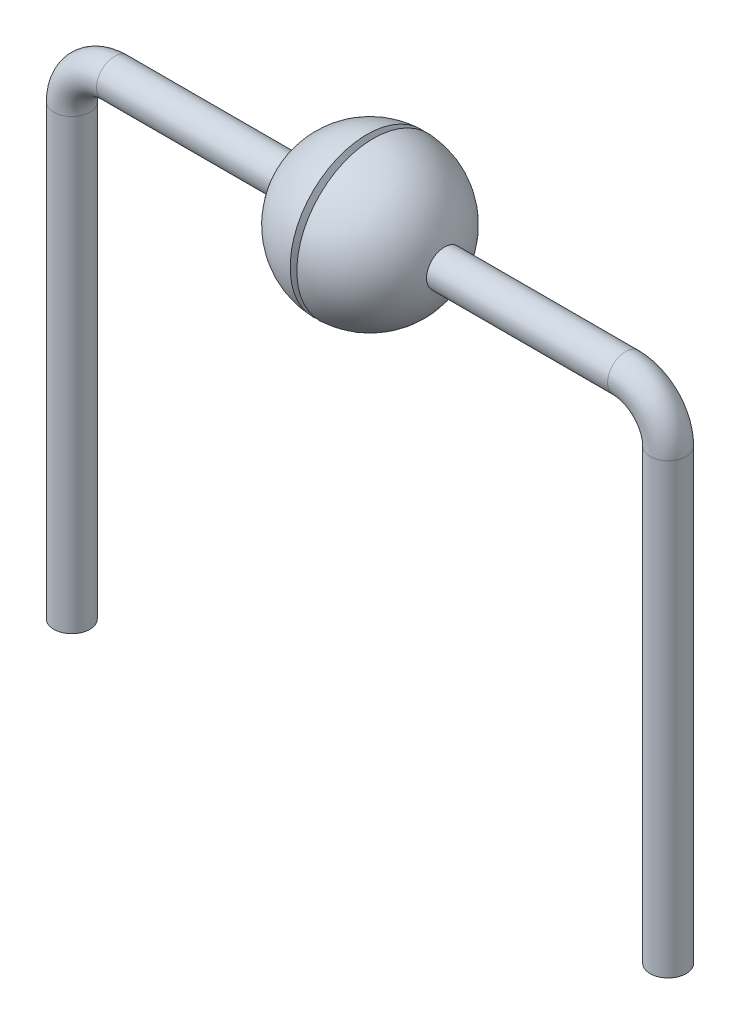
ISO-10303-21;
HEADER;
FILE_DESCRIPTION(('STEP AP214'),'2;1');
FILE_NAME('part.step','',(''),(''),'','','');
FILE_SCHEMA(('AUTOMOTIVE_DESIGN { 1 0 10303 214 1 1 1 1 }'));
ENDSEC;
DATA;
#1=APPLICATION_CONTEXT('core data for automotive mechanical design processes');
#2=APPLICATION_PROTOCOL_DEFINITION('international standard','automotive_design',2000,#1);
#3=PRODUCT_CONTEXT('',#1,'mechanical');
#4=PRODUCT('Part','Part','',(#3));
#5=PRODUCT_RELATED_PRODUCT_CATEGORY('part','',(#4));
#6=PRODUCT_DEFINITION_FORMATION('','',#4);
#7=PRODUCT_DEFINITION_CONTEXT('part definition',#1,'design');
#8=PRODUCT_DEFINITION('design','',#6,#7);
#9=PRODUCT_DEFINITION_SHAPE('','',#8);
#10=(LENGTH_UNIT() NAMED_UNIT(*) SI_UNIT(.MILLI.,.METRE.));
#11=(NAMED_UNIT(*) PLANE_ANGLE_UNIT() SI_UNIT($,.RADIAN.));
#12=(NAMED_UNIT(*) SI_UNIT($,.STERADIAN.) SOLID_ANGLE_UNIT());
#13=UNCERTAINTY_MEASURE_WITH_UNIT(LENGTH_MEASURE(1.E-05),#10,'distance_accuracy_value','');
#14=(GEOMETRIC_REPRESENTATION_CONTEXT(3) GLOBAL_UNCERTAINTY_ASSIGNED_CONTEXT((#13)) GLOBAL_UNIT_ASSIGNED_CONTEXT((#10,
#11,#12)) REPRESENTATION_CONTEXT('',''));
#15=CARTESIAN_POINT('',(0.,0.,0.));
#16=DIRECTION('',(0.,0.,1.));
#17=DIRECTION('',(1.,0.,0.));
#18=AXIS2_PLACEMENT_3D('',#15,#16,#17);
#19=CARTESIAN_POINT('',(0.,0.,0.));
#20=DIRECTION('',(-1.,0.,0.));
#21=DIRECTION('',(0.,0.,-1.));
#22=AXIS2_PLACEMENT_3D('',#19,#20,#21);
#23=SPHERICAL_SURFACE('',#22,1.8);
#24=CARTESIAN_POINT('',(-0.0757594654296964,0.,0.));
#25=DIRECTION('',(-1.,0.,0.));
#26=DIRECTION('',(0.,0.,1.));
#27=AXIS2_PLACEMENT_3D('',#24,#25,#26);
#28=CIRCLE('',#27,1.79840498870466);
#29=CARTESIAN_POINT('',(-0.0757594654296965,0.,-1.79840498870466));
#30=VERTEX_POINT('',#29);
#31=EDGE_CURVE('E51',#30,#30,#28,.T.);
#32=CARTESIAN_POINT('',(-1.74957838479417,0.,0.));
#33=DIRECTION('',(-1.,0.,0.));
#34=DIRECTION('',(0.,0.,1.));
#35=AXIS2_PLACEMENT_3D('',#32,#33,#34);
#36=CIRCLE('',#35,0.423054931966296);
#37=CARTESIAN_POINT('',(-1.74957838479417,0.,-0.423054931966299));
#38=VERTEX_POINT('',#37);
#39=EDGE_CURVE('E10',#38,#38,#36,.T.);
#40=CARTESIAN_POINT('',(-0.0757594654296965,0.,-1.79840498870466));
#41=CARTESIAN_POINT('',(-0.099952631636869,0.,-1.79738611513024));
#42=CARTESIAN_POINT('',(-0.124125188852358,0.,-1.79587849255321));
#43=CARTESIAN_POINT('',(-0.172389823168664,0.,-1.79188945530046));
#44=CARTESIAN_POINT('',(-0.196481900269483,0.,-1.78940804062473));
#45=CARTESIAN_POINT('',(-0.244546312225146,0.,-1.78347512508105));
#46=CARTESIAN_POINT('',(-0.268518647079991,0.,-1.7800236242131));
#47=CARTESIAN_POINT('',(-0.316304542533428,0.,-1.77215624692101));
#48=CARTESIAN_POINT('',(-0.340118103132021,0.,-1.76774037049687));
#49=CARTESIAN_POINT('',(-0.387547667219825,0.,-1.75795140937531));
#50=CARTESIAN_POINT('',(-0.411163670709036,0.,-1.75257832467788));
#51=CARTESIAN_POINT('',(-0.458159661972075,0.,-1.74088370363389));
#52=CARTESIAN_POINT('',(-0.481539649745902,0.,-1.73456216728732));
#53=CARTESIAN_POINT('',(-0.528025534652932,0.,-1.72098093596718));
#54=CARTESIAN_POINT('',(-0.551131431786133,0.,-1.71372124099362));
#55=CARTESIAN_POINT('',(-0.59703150702984,0.,-1.69827551544233));
#56=CARTESIAN_POINT('',(-0.619825685140346,0.,-1.69008948486461));
#57=CARTESIAN_POINT('',(-0.665065201548812,0.,-1.67280441909715));
#58=CARTESIAN_POINT('',(-0.687510539846772,0.,-1.66370538390742));
#59=CARTESIAN_POINT('',(-0.732015823945979,0.,-1.64460912691185));
#60=CARTESIAN_POINT('',(-0.754075769747226,0.,-1.634611905106));
#61=CARTESIAN_POINT('',(-0.79777434378482,0.,-1.61373555554697));
#62=CARTESIAN_POINT('',(-0.819412972021168,0.,-1.6028564277938));
#63=CARTESIAN_POINT('',(-0.862233671985881,0.,-1.58023398322186));
#64=CARTESIAN_POINT('',(-0.883415743714247,0.,-1.5684906664031));
#65=CARTESIAN_POINT('',(-0.92528883523116,0.,-1.54415896792806));
#66=CARTESIAN_POINT('',(-0.945979855019707,0.,-1.53157058627178));
#67=CARTESIAN_POINT('',(-0.986837146913218,0.,-1.50556925855575));
#68=CARTESIAN_POINT('',(-1.00700341901818,0.,-1.492156312496));
#69=CARTESIAN_POINT('',(-1.04677837436295,0.,-1.46452769922662));
#70=CARTESIAN_POINT('',(-1.06638705760276,0.,-1.45031203201701));
#71=CARTESIAN_POINT('',(-1.10501490208037,0.,-1.4211011269492));
#72=CARTESIAN_POINT('',(-1.12403406331818,0.,-1.406105889091));
#73=CARTESIAN_POINT('',(-1.16145189070344,0.,-1.37536026277385));
#74=CARTESIAN_POINT('',(-1.1798505568509,0.,-1.3596098743149));
#75=CARTESIAN_POINT('',(-1.21599743145592,0.,-1.32737959662208));
#76=CARTESIAN_POINT('',(-1.23374563991347,0.,-1.3108997073882));
#77=CARTESIAN_POINT('',(-1.2685626958226,0.,-1.27723726597812));
#78=CARTESIAN_POINT('',(-1.28563154327417,0.,-1.2600547138019));
#79=CARTESIAN_POINT('',(-1.31906208020844,0.,-1.22501492864054));
#80=CARTESIAN_POINT('',(-1.33542376969113,0.,-1.20715769565538));
#81=CARTESIAN_POINT('',(-1.36741334534557,0.,-1.1707976297408));
#82=CARTESIAN_POINT('',(-1.38304123151732,0.,-1.15229479681137));
#83=CARTESIAN_POINT('',(-1.41353775022209,0.,-1.11467366324567));
#84=CARTESIAN_POINT('',(-1.42840638275512,0.,-1.09555536260941));
#85=CARTESIAN_POINT('',(-1.45736018031166,0.,-1.05673442816826));
#86=CARTESIAN_POINT('',(-1.47144534533517,0.,-1.03703179436336));
#87=CARTESIAN_POINT('',(-1.49880926990546,0.,-0.997074279724639));
#88=CARTESIAN_POINT('',(-1.51208802945223,0.,-0.976819398890803));
#89=CARTESIAN_POINT('',(-1.53781751830874,0.,-0.935790375667727));
#90=CARTESIAN_POINT('',(-1.55026824761849,0.,-0.915016233278487));
#91=CARTESIAN_POINT('',(-1.57432139985639,0.,-0.87298251808932));
#92=CARTESIAN_POINT('',(-1.58592382278455,0.,-0.851722945289394));
#93=CARTESIAN_POINT('',(-1.60826146703245,0.,-0.808752990795412));
#94=CARTESIAN_POINT('',(-1.61899668835219,0.,-0.787042609101356));
#95=CARTESIAN_POINT('',(-1.63958244852545,0.,-0.743206393089398));
#96=CARTESIAN_POINT('',(-1.64943298737898,0.,-0.721080558771497));
#97=CARTESIAN_POINT('',(-1.66823333459683,0.,-0.676449468107176));
#98=CARTESIAN_POINT('',(-1.67718314296115,0.,-0.653944211760757));
#99=CARTESIAN_POINT('',(-1.6941674774756,0.,-0.608590933920623));
#100=CARTESIAN_POINT('',(-1.70220200362573,0.,-0.585742912426909));
#101=CARTESIAN_POINT('',(-1.71734260267004,0.,-0.539741288063507));
#102=CARTESIAN_POINT('',(-1.72444867556422,0.,-0.516587685193819));
#103=CARTESIAN_POINT('',(-1.7377211191089,0.,-0.470012696345255));
#104=CARTESIAN_POINT('',(-1.7438874897594,0.,-0.446591310366378));
#105=CARTESIAN_POINT('',(-1.74957838479417,0.,-0.423054931966299));
#106=B_SPLINE_CURVE_WITH_KNOTS('',3,(#40,#41,#42,#43,#44,#45,#46,#47,#48,#49,#50,#51,#52,#53,
#54,#55,#56,#57,#58,#59,#60,#61,#62,#63,#64,#65,#66,#67,#68,#69,#70,#71,#72,#73,#74,#75,#76,#77,
#78,#79,#80,#81,#82,#83,#84,#85,#86,#87,#88,#89,#90,#91,#92,#93,#94,#95,#96,#97,#98,#99,#100,
#101,#102,#103,#104,#105),.UNSPECIFIED.,.F.,.F.,(4,2,2,2,2,2,2,2,2,2,2,2,2,2,2,2,2,2,2,2,2,2,2,
2,2,2,2,2,2,2,2,2,4),(0.,0.0726388701913701,0.14527774038274,0.21791661057411,0.29055548076548,
0.363194350956851,0.435833221148221,0.508472091339591,0.581110961530961,0.653749831722331,
0.726388701913701,0.799027572105071,0.871666442296441,0.944305312487812,1.01694418267918,
1.08958305287055,1.16222192306192,1.23486079325329,1.30749966344466,1.38013853363603,
1.4527774038274,1.52541627401877,1.59805514421014,1.67069401440151,1.74333288459288,
1.81597175478425,1.88861062497562,1.96124949516699,2.03388836535836,2.10652723554973,
2.1791661057411,2.25180497593247,2.32444384612384),.UNSPECIFIED.);
#107=EDGE_CURVE('BSEAM37',#30,#38,#106,.T.);
#108=ORIENTED_EDGE('',*,*,#31,.T.);
#109=ORIENTED_EDGE('',*,*,#39,.F.);
#110=ORIENTED_EDGE('',*,*,#107,.T.);
#111=ORIENTED_EDGE('',*,*,#107,.F.);
#112=EDGE_LOOP('',(#108,#110,#109,#111));
#113=FACE_BOUND('',#112,.T.);
#114=ADVANCED_FACE('F37',(#113),#23,.T.);
#115=CARTESIAN_POINT('',(0.,0.,0.));
#116=DIRECTION('',(-1.,0.,0.));
#117=DIRECTION('',(0.,0.,-1.));
#118=AXIS2_PLACEMENT_3D('',#115,#116,#117);
#119=SPHERICAL_SURFACE('',#118,1.8);
#120=CARTESIAN_POINT('',(1.74957838479417,0.,0.));
#121=DIRECTION('',(-1.,0.,0.));
#122=DIRECTION('',(0.,0.,1.));
#123=AXIS2_PLACEMENT_3D('',#120,#121,#122);
#124=CIRCLE('',#123,0.423054931966297);
#125=CARTESIAN_POINT('',(1.74957838479417,0.,-0.423054931966296));
#126=VERTEX_POINT('',#125);
#127=EDGE_CURVE('E72',#126,#126,#124,.T.);
#128=CARTESIAN_POINT('',(0.0809607239177813,0.,0.));
#129=DIRECTION('',(-1.,0.,0.));
#130=DIRECTION('',(0.,0.,1.));
#131=AXIS2_PLACEMENT_3D('',#128,#129,#130);
#132=CIRCLE('',#131,1.79817834521015);
#133=CARTESIAN_POINT('',(0.0809607239177813,0.,-1.79817834521015));
#134=VERTEX_POINT('',#133);
#135=EDGE_CURVE('E43',#134,#134,#132,.T.);
#136=CARTESIAN_POINT('',(1.74957838479417,0.,-0.423054931966296));
#137=CARTESIAN_POINT('',(1.74390023330024,0.,-0.44653859756378));
#138=CARTESIAN_POINT('',(1.73774873595899,0.,-0.469907785955478));
#139=CARTESIAN_POINT('',(1.7245102187887,0.,-0.516379662139358));
#140=CARTESIAN_POINT('',(1.71742319895966,0.,-0.539482349931541));
#141=CARTESIAN_POINT('',(1.70232480602064,0.,-0.585383678728447));
#142=CARTESIAN_POINT('',(1.69431343291066,0.,-0.608182319733171));
#143=CARTESIAN_POINT('',(1.67737940760938,0.,-0.653438617468616));
#144=CARTESIAN_POINT('',(1.66845675541807,0.,-0.675896274199336));
#145=CARTESIAN_POINT('',(1.64971461465688,0.,-0.720434187695304));
#146=CARTESIAN_POINT('',(1.63989512608699,0.,-0.742514444460551));
#147=CARTESIAN_POINT('',(1.61937523843192,0.,-0.786261762500008));
#148=CARTESIAN_POINT('',(1.60867483934674,0.,-0.807928823774217));
#149=CARTESIAN_POINT('',(1.58641047686894,0.,-0.850814622965795));
#150=CARTESIAN_POINT('',(1.57484651347633,0.,-0.872033360883163));
#151=CARTESIAN_POINT('',(1.55087377072699,0.,-0.913988112929484));
#152=CARTESIAN_POINT('',(1.53846499137028,0.,-0.934724127058436));
#153=CARTESIAN_POINT('',(1.51282273411983,0.,-0.975679813545079));
#154=CARTESIAN_POINT('',(1.4995892562261,0.,-0.99589948590277));
#155=CARTESIAN_POINT('',(1.47231905650915,0.,-1.03578970801817));
#156=CARTESIAN_POINT('',(1.45828233468593,0.,-1.05546025777589));
#157=CARTESIAN_POINT('',(1.42942840392429,0.,-1.09422034410784));
#158=CARTESIAN_POINT('',(1.41461119498587,0.,-1.11330988068208));
#159=CARTESIAN_POINT('',(1.38422031217183,0.,-1.1508769920255));
#160=CARTESIAN_POINT('',(1.36864663829621,0.,-1.16935456679469));
#161=CARTESIAN_POINT('',(1.33676807419021,0.,-1.20566779803939));
#162=CARTESIAN_POINT('',(1.32046318395983,0.,-1.22350345451491));
#163=CARTESIAN_POINT('',(1.28714862120098,0.,-1.25850393338424));
#164=CARTESIAN_POINT('',(1.2701389486725,0.,-1.27566875577805));
#165=CARTESIAN_POINT('',(1.23544239799155,0.,-1.30929973827543));
#166=CARTESIAN_POINT('',(1.21775551983908,0.,-1.325765898379));
#167=CARTESIAN_POINT('',(1.18173323249363,0.,-1.35797286078308));
#168=CARTESIAN_POINT('',(1.16339782330067,0.,-1.37371366308358));
#169=CARTESIAN_POINT('',(1.12610819987887,0.,-1.40444439034402));
#170=CARTESIAN_POINT('',(1.10715398565005,0.,-1.41943431530397));
#171=CARTESIAN_POINT('',(1.06865748138947,0.,-1.44863898569434));
#172=CARTESIAN_POINT('',(1.04911519135772,0.,-1.46285373112478));
#173=CARTESIAN_POINT('',(1.00947421813323,0.,-1.49048499701524));
#174=CARTESIAN_POINT('',(0.989375534940481,0.,-1.50390151747527));
#175=CARTESIAN_POINT('',(0.948654360079914,0.,-1.52991458209425));
#176=CARTESIAN_POINT('',(0.928031868412094,0.,-1.5425111262532));
#177=CARTESIAN_POINT('',(0.886296510503846,0.,-1.56686381631328));
#178=CARTESIAN_POINT('',(0.865183644263418,0.,-1.57861996221441));
#179=CARTESIAN_POINT('',(0.822501766124844,0.,-1.60127279628589));
#180=CARTESIAN_POINT('',(0.800932754226698,0.,-1.61216948445623));
#181=CARTESIAN_POINT('',(0.757373553206563,0.,-1.633085736973));
#182=CARTESIAN_POINT('',(0.735383364084574,0.,-1.64310530131943));
#183=CARTESIAN_POINT('',(0.691017459878785,0.,-1.66225106213015));
#184=CARTESIAN_POINT('',(0.668641744794986,0.,-1.67137725859444));
#185=CARTESIAN_POINT('',(0.623541064952169,0.,-1.68872148790007));
#186=CARTESIAN_POINT('',(0.600816100193152,0.,-1.6969395207414));
#187=CARTESIAN_POINT('',(0.555053763515562,0.,-1.71245409956265));
#188=CARTESIAN_POINT('',(0.532016391596989,0.,-1.71975064554257));
#189=CARTESIAN_POINT('',(0.485666589551624,0.,-1.73341042076761));
#190=CARTESIAN_POINT('',(0.462354159424832,0.,-1.73977365001273));
#191=CARTESIAN_POINT('',(0.415492036033817,0.,-1.75155647719076));
#192=CARTESIAN_POINT('',(0.391942342769593,0.,-1.75697607512367));
#193=CARTESIAN_POINT('',(0.344643872141503,0.,-1.76686284684807));
#194=CARTESIAN_POINT('',(0.320895094777637,0.,-1.77133002063956));
#195=CARTESIAN_POINT('',(0.273236960333717,0.,-1.77930472558388));
#196=CARTESIAN_POINT('',(0.249327603253664,0.,-1.78281225673671));
#197=CARTESIAN_POINT('',(0.201387064456192,0.,-1.78886190089738));
#198=CARTESIAN_POINT('',(0.177355882738772,0.,-1.79140401390523));
#199=CARTESIAN_POINT('',(0.129210683236434,0.,-1.79551903247118));
#200=CARTESIAN_POINT('',(0.105096665451515,0.,-1.79709193802928));
#201=CARTESIAN_POINT('',(0.0809607239177812,0.,-1.79817834521015));
#202=B_SPLINE_CURVE_WITH_KNOTS('',3,(#136,#137,#138,#139,#140,#141,#142,#143,#144,#145,#146,
#147,#148,#149,#150,#151,#152,#153,#154,#155,#156,#157,#158,#159,#160,#161,#162,#163,#164,#165,
#166,#167,#168,#169,#170,#171,#172,#173,#174,#175,#176,#177,#178,#179,#180,#181,#182,#183,#184,
#185,#186,#187,#188,#189,#190,#191,#192,#193,#194,#195,#196,#197,#198,#199,#200,#201),
.UNSPECIFIED.,.F.,.F.,(4,2,2,2,2,2,2,2,2,2,2,2,2,2,2,2,2,2,2,2,2,2,2,2,2,2,2,2,2,2,2,2,4),(0.,
0.0724762096166364,0.144952419233273,0.217428628849909,0.289904838466545,0.362381048083181,
0.434857257699818,0.507333467316454,0.57980967693309,0.652285886549726,0.724762096166362,
0.797238305782999,0.869714515399635,0.942190725016271,1.01466693463291,1.08714314424954,
1.15961935386618,1.23209556348282,1.30457177309945,1.37704798271609,1.44952419233273,
1.52200040194936,1.594476611566,1.66695282118263,1.73942903079927,1.81190524041591,
1.88438145003254,1.95685765964918,2.02933386926582,2.10181007888245,2.17428628849909,
2.24676249811572,2.31923870773236),.UNSPECIFIED.);
#203=EDGE_CURVE('BSEAM102',#126,#134,#202,.T.);
#204=ORIENTED_EDGE('',*,*,#127,.T.);
#205=ORIENTED_EDGE('',*,*,#135,.F.);
#206=ORIENTED_EDGE('',*,*,#203,.T.);
#207=ORIENTED_EDGE('',*,*,#203,.F.);
#208=EDGE_LOOP('',(#204,#206,#205,#207));
#209=FACE_BOUND('',#208,.T.);
#210=ADVANCED_FACE('F102',(#209),#119,.T.);
#211=CARTESIAN_POINT('',(0.,0.,0.));
#212=DIRECTION('',(1.,0.,0.));
#213=DIRECTION('',(0.,0.,-1.));
#214=AXIS2_PLACEMENT_3D('',#211,#212,#213);
#215=CONICAL_SURFACE('',#214,1.64585670640349,1.08225834723102);
#216=ORIENTED_EDGE('',*,*,#135,.T.);
#217=EDGE_LOOP('',(#216));
#218=FACE_BOUND('',#217,.T.);
#219=CARTESIAN_POINT('',(0.,0.,0.));
#220=DIRECTION('',(-1.,0.,0.));
#221=DIRECTION('',(0.,0.,1.));
#222=AXIS2_PLACEMENT_3D('',#219,#220,#221);
#223=CIRCLE('',#222,1.64585670640349);
#224=CARTESIAN_POINT('',(0.,0.,1.6458567064035));
#225=VERTEX_POINT('',#224);
#226=EDGE_CURVE('E47',#225,#225,#223,.T.);
#227=ORIENTED_EDGE('',*,*,#226,.F.);
#228=EDGE_LOOP('',(#227));
#229=FACE_BOUND('',#228,.T.);
#230=ADVANCED_FACE('F107',(#218,#229),#215,.T.);
#231=CARTESIAN_POINT('',(-0.0757594654296964,0.,0.));
#232=DIRECTION('',(-1.,0.,0.));
#233=DIRECTION('',(0.,0.,1.));
#234=AXIS2_PLACEMENT_3D('',#231,#232,#233);
#235=CONICAL_SURFACE('',#234,1.79840498870466,1.10985144232575);
#236=ORIENTED_EDGE('',*,*,#226,.T.);
#237=EDGE_LOOP('',(#236));
#238=FACE_BOUND('',#237,.T.);
#239=ORIENTED_EDGE('',*,*,#31,.F.);
#240=EDGE_LOOP('',(#239));
#241=FACE_BOUND('',#240,.T.);
#242=ADVANCED_FACE('F112',(#238,#241),#235,.T.);
#243=CARTESIAN_POINT('',(-7.,-0.999999999999999,0.));
#244=DIRECTION('',(0.,-1.,0.));
#245=DIRECTION('',(1.,0.,0.));
#246=AXIS2_PLACEMENT_3D('',#243,#244,#245);
#247=CYLINDRICAL_SURFACE('',#246,0.423054931966297);
#248=CARTESIAN_POINT('',(-7.,-0.999999999999999,0.));
#249=DIRECTION('',(0.,-1.,0.));
#250=DIRECTION('',(0.,0.,1.));
#251=AXIS2_PLACEMENT_3D('',#248,#249,#250);
#252=CIRCLE('',#251,0.423054931966297);
#253=CARTESIAN_POINT('',(-7.4230549319663,-0.999999999999999,0.));
#254=VERTEX_POINT('',#253);
#255=EDGE_CURVE('E59',#254,#254,#252,.T.);
#256=ORIENTED_EDGE('',*,*,#255,.T.);
#257=EDGE_LOOP('',(#256));
#258=FACE_BOUND('',#257,.T.);
#259=CARTESIAN_POINT('',(-7.,-11.514871197813,0.));
#260=DIRECTION('',(0.,-1.,0.));
#261=DIRECTION('',(0.,0.,1.));
#262=AXIS2_PLACEMENT_3D('',#259,#260,#261);
#263=CIRCLE('',#262,0.423054931966297);
#264=CARTESIAN_POINT('',(-7.,-11.514871197813,0.423054931966297));
#265=VERTEX_POINT('',#264);
#266=EDGE_CURVE('E56',#265,#265,#263,.T.);
#267=ORIENTED_EDGE('',*,*,#266,.F.);
#268=EDGE_LOOP('',(#267));
#269=FACE_BOUND('',#268,.T.);
#270=ADVANCED_FACE('F114',(#258,#269),#247,.T.);
#271=CARTESIAN_POINT('',(-6.,-1.,0.));
#272=DIRECTION('',(0.,0.,1.));
#273=DIRECTION('',(1.,0.,0.));
#274=AXIS2_PLACEMENT_3D('',#271,#272,#273);
#275=TOROIDAL_SURFACE('',#274,0.999999999999999,0.423054931966297);
#276=CARTESIAN_POINT('',(-6.,0.,0.));
#277=DIRECTION('',(-1.,0.,0.));
#278=DIRECTION('',(0.,0.,1.));
#279=AXIS2_PLACEMENT_3D('',#276,#277,#278);
#280=CIRCLE('',#279,0.423054931966297);
#281=CARTESIAN_POINT('',(-6.,0.423054931966296,0.));
#282=VERTEX_POINT('',#281);
#283=EDGE_CURVE('E62',#282,#282,#280,.T.);
#284=CARTESIAN_POINT('',(-6.,-1.,0.));
#285=DIRECTION('',(0.,0.,1.));
#286=DIRECTION('',(1.,0.,0.));
#287=AXIS2_PLACEMENT_3D('',#284,#285,#286);
#288=CIRCLE('',#287,1.4230549319663);
#289=EDGE_CURVE('',#282,#254,#288,.T.);
#290=ORIENTED_EDGE('',*,*,#283,.T.);
#291=ORIENTED_EDGE('',*,*,#255,.F.);
#292=ORIENTED_EDGE('',*,*,#289,.T.);
#293=ORIENTED_EDGE('',*,*,#289,.F.);
#294=EDGE_LOOP('',(#290,#292,#291,#293));
#295=FACE_BOUND('',#294,.T.);
#296=ADVANCED_FACE('F121',(#295),#275,.T.);
#297=CARTESIAN_POINT('',(-6.,0.,0.));
#298=DIRECTION('',(1.,0.,0.));
#299=DIRECTION('',(0.,1.,0.));
#300=AXIS2_PLACEMENT_3D('',#297,#298,#299);
#301=CYLINDRICAL_SURFACE('',#300,0.423054931966297);
#302=ORIENTED_EDGE('',*,*,#283,.F.);
#303=EDGE_LOOP('',(#302));
#304=FACE_BOUND('',#303,.T.);
#305=ORIENTED_EDGE('',*,*,#39,.T.);
#306=EDGE_LOOP('',(#305));
#307=FACE_BOUND('',#306,.T.);
#308=ADVANCED_FACE('F128',(#304,#307),#301,.T.);
#309=CARTESIAN_POINT('',(-7.,-11.514871197813,0.));
#310=DIRECTION('',(0.,-1.,0.));
#311=DIRECTION('',(0.,0.,1.));
#312=AXIS2_PLACEMENT_3D('',#309,#310,#311);
#313=PLANE('',#312);
#314=ORIENTED_EDGE('',*,*,#266,.T.);
#315=EDGE_LOOP('',(#314));
#316=FACE_BOUND('',#315,.T.);
#317=ADVANCED_FACE('F90',(#316),#313,.T.);
#318=CARTESIAN_POINT('',(7.,-0.999999999999999,0.));
#319=DIRECTION('',(0.,-1.,0.));
#320=DIRECTION('',(1.,0.,0.));
#321=AXIS2_PLACEMENT_3D('',#318,#319,#320);
#322=CYLINDRICAL_SURFACE('',#321,0.423054931966297);
#323=CARTESIAN_POINT('',(7.,-0.999999999999999,0.));
#324=DIRECTION('',(0.,1.,0.));
#325=DIRECTION('',(0.,0.,1.));
#326=AXIS2_PLACEMENT_3D('',#323,#324,#325);
#327=CIRCLE('',#326,0.423054931966297);
#328=CARTESIAN_POINT('',(7.4230549319663,-0.999999999999999,0.));
#329=VERTEX_POINT('',#328);
#330=EDGE_CURVE('E68',#329,#329,#327,.T.);
#331=ORIENTED_EDGE('',*,*,#330,.F.);
#332=EDGE_LOOP('',(#331));
#333=FACE_BOUND('',#332,.T.);
#334=CARTESIAN_POINT('',(7.,-11.514871197813,0.));
#335=DIRECTION('',(0.,1.,0.));
#336=DIRECTION('',(0.,0.,1.));
#337=AXIS2_PLACEMENT_3D('',#334,#335,#336);
#338=CIRCLE('',#337,0.423054931966297);
#339=CARTESIAN_POINT('',(7.,-11.514871197813,0.423054931966297));
#340=VERTEX_POINT('',#339);
#341=EDGE_CURVE('E65',#340,#340,#338,.T.);
#342=ORIENTED_EDGE('',*,*,#341,.T.);
#343=EDGE_LOOP('',(#342));
#344=FACE_BOUND('',#343,.T.);
#345=ADVANCED_FACE('F84',(#333,#344),#322,.T.);
#346=CARTESIAN_POINT('',(6.,-1.,0.));
#347=DIRECTION('',(0.,0.,-1.));
#348=DIRECTION('',(-1.,0.,0.));
#349=AXIS2_PLACEMENT_3D('',#346,#347,#348);
#350=TOROIDAL_SURFACE('',#349,0.999999999999999,0.423054931966297);
#351=CARTESIAN_POINT('',(6.,0.,0.));
#352=DIRECTION('',(-1.,0.,0.));
#353=DIRECTION('',(0.,0.,1.));
#354=AXIS2_PLACEMENT_3D('',#351,#352,#353);
#355=CIRCLE('',#354,0.423054931966297);
#356=CARTESIAN_POINT('',(6.,0.423054931966296,0.));
#357=VERTEX_POINT('',#356);
#358=EDGE_CURVE('E71',#357,#357,#355,.T.);
#359=CARTESIAN_POINT('',(6.,-1.,0.));
#360=DIRECTION('',(0.,0.,-1.));
#361=DIRECTION('',(-1.,0.,0.));
#362=AXIS2_PLACEMENT_3D('',#359,#360,#361);
#363=CIRCLE('',#362,1.4230549319663);
#364=EDGE_CURVE('',#357,#329,#363,.T.);
#365=ORIENTED_EDGE('',*,*,#358,.F.);
#366=ORIENTED_EDGE('',*,*,#330,.T.);
#367=ORIENTED_EDGE('',*,*,#364,.T.);
#368=ORIENTED_EDGE('',*,*,#364,.F.);
#369=EDGE_LOOP('',(#365,#367,#366,#368));
#370=FACE_BOUND('',#369,.T.);
#371=ADVANCED_FACE('F81',(#370),#350,.T.);
#372=CARTESIAN_POINT('',(6.,0.,0.));
#373=DIRECTION('',(-1.,0.,0.));
#374=DIRECTION('',(0.,-1.,0.));
#375=AXIS2_PLACEMENT_3D('',#372,#373,#374);
#376=CYLINDRICAL_SURFACE('',#375,0.423054931966297);
#377=ORIENTED_EDGE('',*,*,#358,.T.);
#378=EDGE_LOOP('',(#377));
#379=FACE_BOUND('',#378,.T.);
#380=ORIENTED_EDGE('',*,*,#127,.F.);
#381=EDGE_LOOP('',(#380));
#382=FACE_BOUND('',#381,.T.);
#383=ADVANCED_FACE('F78',(#379,#382),#376,.T.);
#384=CARTESIAN_POINT('',(7.,-11.514871197813,0.));
#385=DIRECTION('',(0.,-1.,0.));
#386=DIRECTION('',(0.,0.,1.));
#387=AXIS2_PLACEMENT_3D('',#384,#385,#386);
#388=PLANE('',#387);
#389=ORIENTED_EDGE('',*,*,#341,.F.);
#390=EDGE_LOOP('',(#389));
#391=FACE_BOUND('',#390,.T.);
#392=ADVANCED_FACE('F94',(#391),#388,.T.);
#393=CLOSED_SHELL('',(#114,#210,#230,#242,#270,#296,#308,#317,#345,#371,#383,#392));
#394=MANIFOLD_SOLID_BREP('B2',#393);
#395=ADVANCED_BREP_SHAPE_REPRESENTATION('',(#18,#394),#14);
#396=SHAPE_DEFINITION_REPRESENTATION(#9,#395);
ENDSEC;
END-ISO-10303-21;
